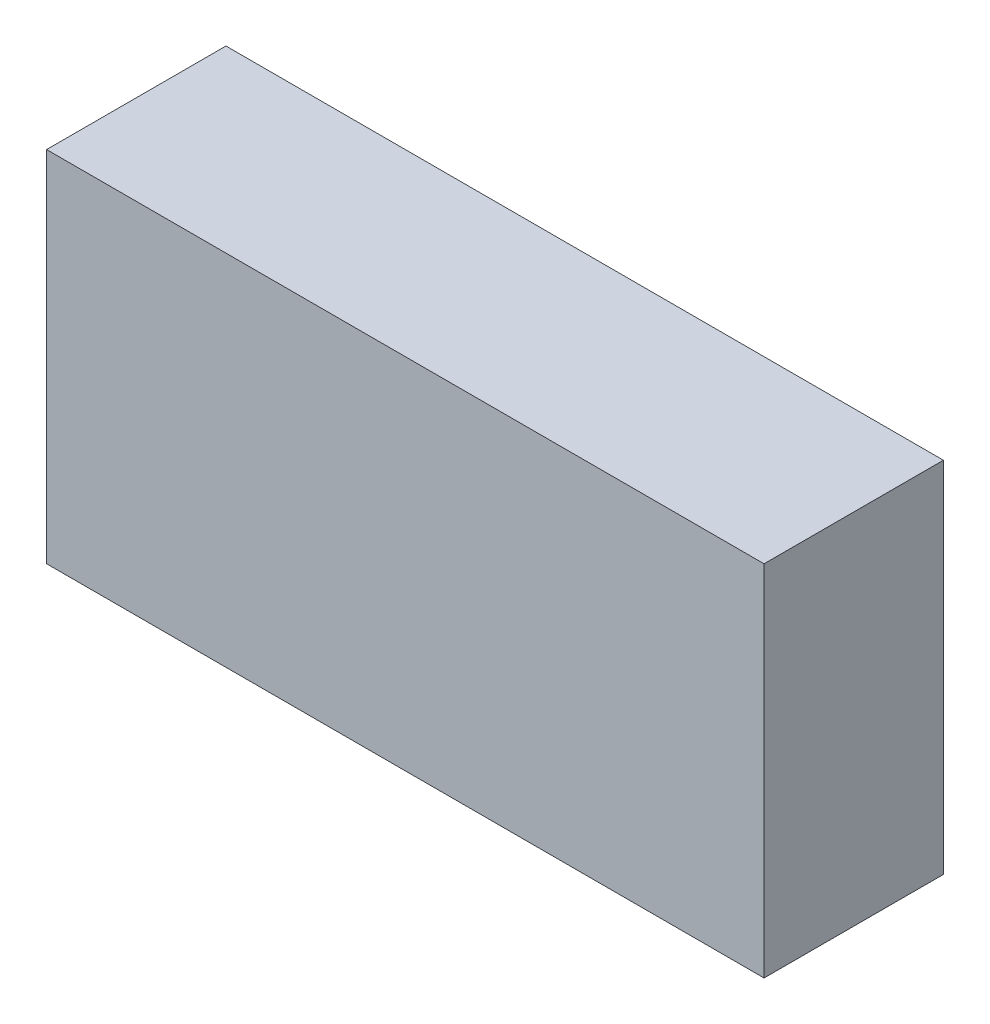
ISO-10303-21;
HEADER;
FILE_DESCRIPTION(('STEP AP214'),'2;1');
FILE_NAME('part.step','',(''),(''),'','','');
FILE_SCHEMA(('AUTOMOTIVE_DESIGN { 1 0 10303 214 1 1 1 1 }'));
ENDSEC;
DATA;
#1=APPLICATION_CONTEXT('core data for automotive mechanical design processes');
#2=APPLICATION_PROTOCOL_DEFINITION('international standard','automotive_design',2000,#1);
#3=PRODUCT_CONTEXT('',#1,'mechanical');
#4=PRODUCT('Part','Part','',(#3));
#5=PRODUCT_RELATED_PRODUCT_CATEGORY('part','',(#4));
#6=PRODUCT_DEFINITION_FORMATION('','',#4);
#7=PRODUCT_DEFINITION_CONTEXT('part definition',#1,'design');
#8=PRODUCT_DEFINITION('design','',#6,#7);
#9=PRODUCT_DEFINITION_SHAPE('','',#8);
#10=(LENGTH_UNIT() NAMED_UNIT(*) SI_UNIT(.MILLI.,.METRE.));
#11=(NAMED_UNIT(*) PLANE_ANGLE_UNIT() SI_UNIT($,.RADIAN.));
#12=(NAMED_UNIT(*) SI_UNIT($,.STERADIAN.) SOLID_ANGLE_UNIT());
#13=UNCERTAINTY_MEASURE_WITH_UNIT(LENGTH_MEASURE(1.E-05),#10,'distance_accuracy_value','');
#14=(GEOMETRIC_REPRESENTATION_CONTEXT(3) GLOBAL_UNCERTAINTY_ASSIGNED_CONTEXT((#13)) GLOBAL_UNIT_ASSIGNED_CONTEXT((#10,
#11,#12)) REPRESENTATION_CONTEXT('',''));
#15=CARTESIAN_POINT('',(0.,0.,0.));
#16=DIRECTION('',(0.,0.,1.));
#17=DIRECTION('',(1.,0.,0.));
#18=AXIS2_PLACEMENT_3D('',#15,#16,#17);
#19=CARTESIAN_POINT('',(20.,-10.,10.));
#20=DIRECTION('',(-1.,0.,0.));
#21=DIRECTION('',(0.,0.,1.));
#22=AXIS2_PLACEMENT_3D('',#19,#20,#21);
#23=PLANE('',#22);
#24=DIRECTION('',(0.,1.,0.));
#25=VECTOR('',#24,1.);
#26=CARTESIAN_POINT('',(20.,-10.,0.));
#27=LINE('',#26,#25);
#28=CARTESIAN_POINT('',(20.,-10.,0.));
#29=VERTEX_POINT('',#28);
#30=CARTESIAN_POINT('',(20.,10.,0.));
#31=VERTEX_POINT('',#30);
#32=EDGE_CURVE('E102',#29,#31,#27,.T.);
#33=ORIENTED_EDGE('',*,*,#32,.T.);
#34=DIRECTION('',(0.,0.,-1.));
#35=VECTOR('',#34,1.);
#36=CARTESIAN_POINT('',(20.,10.,10.));
#37=LINE('',#36,#35);
#38=CARTESIAN_POINT('',(20.,10.,10.));
#39=VERTEX_POINT('',#38);
#40=EDGE_CURVE('E11',#39,#31,#37,.T.);
#41=ORIENTED_EDGE('',*,*,#40,.F.);
#42=DIRECTION('',(0.,1.,0.));
#43=VECTOR('',#42,1.);
#44=CARTESIAN_POINT('',(20.,-10.,10.));
#45=LINE('',#44,#43);
#46=CARTESIAN_POINT('',(20.,-10.,10.));
#47=VERTEX_POINT('',#46);
#48=EDGE_CURVE('E90',#47,#39,#45,.T.);
#49=ORIENTED_EDGE('',*,*,#48,.F.);
#50=DIRECTION('',(0.,0.,-1.));
#51=VECTOR('',#50,1.);
#52=CARTESIAN_POINT('',(20.,-10.,10.));
#53=LINE('',#52,#51);
#54=EDGE_CURVE('E98',#47,#29,#53,.T.);
#55=ORIENTED_EDGE('',*,*,#54,.T.);
#56=EDGE_LOOP('',(#33,#41,#49,#55));
#57=FACE_BOUND('',#56,.T.);
#58=ADVANCED_FACE('F39',(#57),#23,.F.);
#59=CARTESIAN_POINT('',(-20.,10.,10.));
#60=DIRECTION('',(0.,-1.,0.));
#61=DIRECTION('',(0.,0.,-1.));
#62=AXIS2_PLACEMENT_3D('',#59,#60,#61);
#63=PLANE('',#62);
#64=DIRECTION('',(-1.,0.,0.));
#65=VECTOR('',#64,1.);
#66=CARTESIAN_POINT('',(-20.,10.,0.));
#67=LINE('',#66,#65);
#68=CARTESIAN_POINT('',(-20.,10.,0.));
#69=VERTEX_POINT('',#68);
#70=EDGE_CURVE('E94',#31,#69,#67,.T.);
#71=ORIENTED_EDGE('',*,*,#70,.T.);
#72=DIRECTION('',(0.,0.,-1.));
#73=VECTOR('',#72,1.);
#74=CARTESIAN_POINT('',(-20.,10.,10.));
#75=LINE('',#74,#73);
#76=CARTESIAN_POINT('',(-20.,10.,10.));
#77=VERTEX_POINT('',#76);
#78=EDGE_CURVE('E47',#77,#69,#75,.T.);
#79=ORIENTED_EDGE('',*,*,#78,.F.);
#80=DIRECTION('',(-1.,0.,0.));
#81=VECTOR('',#80,1.);
#82=CARTESIAN_POINT('',(-20.,10.,10.));
#83=LINE('',#82,#81);
#84=EDGE_CURVE('E85',#39,#77,#83,.T.);
#85=ORIENTED_EDGE('',*,*,#84,.F.);
#86=ORIENTED_EDGE('',*,*,#40,.T.);
#87=EDGE_LOOP('',(#71,#79,#85,#86));
#88=FACE_BOUND('',#87,.T.);
#89=ADVANCED_FACE('F93',(#88),#63,.F.);
#90=CARTESIAN_POINT('',(-20.,-10.,10.));
#91=DIRECTION('',(1.,0.,0.));
#92=DIRECTION('',(0.,0.,-1.));
#93=AXIS2_PLACEMENT_3D('',#90,#91,#92);
#94=PLANE('',#93);
#95=DIRECTION('',(0.,-1.,0.));
#96=VECTOR('',#95,1.);
#97=CARTESIAN_POINT('',(-20.,-10.,0.));
#98=LINE('',#97,#96);
#99=CARTESIAN_POINT('',(-20.,-10.,0.));
#100=VERTEX_POINT('',#99);
#101=EDGE_CURVE('E72',#69,#100,#98,.T.);
#102=ORIENTED_EDGE('',*,*,#101,.T.);
#103=DIRECTION('',(0.,0.,-1.));
#104=VECTOR('',#103,1.);
#105=CARTESIAN_POINT('',(-20.,-10.,10.));
#106=LINE('',#105,#104);
#107=CARTESIAN_POINT('',(-20.,-10.,10.));
#108=VERTEX_POINT('',#107);
#109=EDGE_CURVE('E95',#108,#100,#106,.T.);
#110=ORIENTED_EDGE('',*,*,#109,.F.);
#111=DIRECTION('',(0.,-1.,0.));
#112=VECTOR('',#111,1.);
#113=CARTESIAN_POINT('',(-20.,-10.,10.));
#114=LINE('',#113,#112);
#115=EDGE_CURVE('E88',#77,#108,#114,.T.);
#116=ORIENTED_EDGE('',*,*,#115,.F.);
#117=ORIENTED_EDGE('',*,*,#78,.T.);
#118=EDGE_LOOP('',(#102,#110,#116,#117));
#119=FACE_BOUND('',#118,.T.);
#120=ADVANCED_FACE('F96',(#119),#94,.F.);
#121=CARTESIAN_POINT('',(-20.,-10.,10.));
#122=DIRECTION('',(0.,1.,0.));
#123=DIRECTION('',(0.,0.,1.));
#124=AXIS2_PLACEMENT_3D('',#121,#122,#123);
#125=PLANE('',#124);
#126=DIRECTION('',(1.,0.,0.));
#127=VECTOR('',#126,1.);
#128=CARTESIAN_POINT('',(-20.,-10.,0.));
#129=LINE('',#128,#127);
#130=EDGE_CURVE('E78',#100,#29,#129,.T.);
#131=ORIENTED_EDGE('',*,*,#130,.T.);
#132=ORIENTED_EDGE('',*,*,#54,.F.);
#133=DIRECTION('',(1.,0.,0.));
#134=VECTOR('',#133,1.);
#135=CARTESIAN_POINT('',(-20.,-10.,10.));
#136=LINE('',#135,#134);
#137=EDGE_CURVE('E55',#108,#47,#136,.T.);
#138=ORIENTED_EDGE('',*,*,#137,.F.);
#139=ORIENTED_EDGE('',*,*,#109,.T.);
#140=EDGE_LOOP('',(#131,#132,#138,#139));
#141=FACE_BOUND('',#140,.T.);
#142=ADVANCED_FACE('F109',(#141),#125,.F.);
#143=CARTESIAN_POINT('',(0.,0.,10.));
#144=DIRECTION('',(0.,0.,-1.));
#145=DIRECTION('',(-1.,0.,0.));
#146=AXIS2_PLACEMENT_3D('',#143,#144,#145);
#147=PLANE('',#146);
#148=ORIENTED_EDGE('',*,*,#48,.T.);
#149=ORIENTED_EDGE('',*,*,#84,.T.);
#150=ORIENTED_EDGE('',*,*,#115,.T.);
#151=ORIENTED_EDGE('',*,*,#137,.T.);
#152=EDGE_LOOP('',(#148,#149,#150,#151));
#153=FACE_BOUND('',#152,.T.);
#154=ADVANCED_FACE('F86',(#153),#147,.F.);
#155=CARTESIAN_POINT('',(0.,0.,0.));
#156=DIRECTION('',(0.,0.,-1.));
#157=DIRECTION('',(-1.,0.,0.));
#158=AXIS2_PLACEMENT_3D('',#155,#156,#157);
#159=PLANE('',#158);
#160=ORIENTED_EDGE('',*,*,#32,.F.);
#161=ORIENTED_EDGE('',*,*,#130,.F.);
#162=ORIENTED_EDGE('',*,*,#101,.F.);
#163=ORIENTED_EDGE('',*,*,#70,.F.);
#164=EDGE_LOOP('',(#160,#161,#162,#163));
#165=FACE_BOUND('',#164,.T.);
#166=ADVANCED_FACE('F112',(#165),#159,.T.);
#167=CLOSED_SHELL('',(#58,#89,#120,#142,#154,#166));
#168=MANIFOLD_SOLID_BREP('B2',#167);
#169=ADVANCED_BREP_SHAPE_REPRESENTATION('',(#18,#168),#14);
#170=SHAPE_DEFINITION_REPRESENTATION(#9,#169);
ENDSEC;
END-ISO-10303-21;
